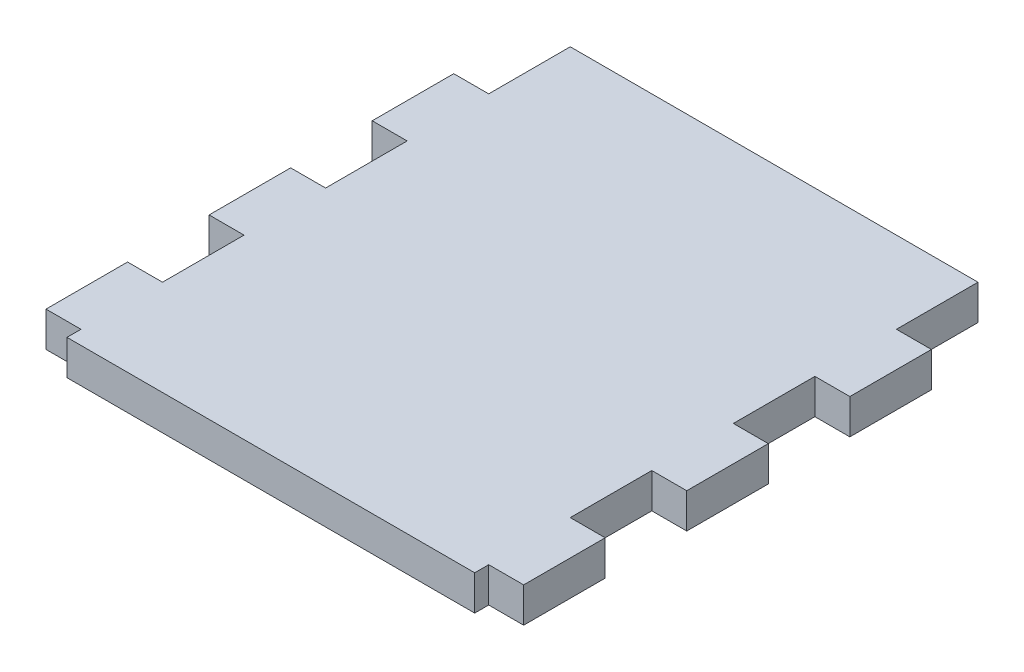
ISO-10303-21;
HEADER;
FILE_DESCRIPTION(('STEP AP214'),'2;1');
FILE_NAME('part.step','',(''),(''),'','','');
FILE_SCHEMA(('AUTOMOTIVE_DESIGN { 1 0 10303 214 1 1 1 1 }'));
ENDSEC;
DATA;
#1=APPLICATION_CONTEXT('core data for automotive mechanical design processes');
#2=APPLICATION_PROTOCOL_DEFINITION('international standard','automotive_design',2000,#1);
#3=PRODUCT_CONTEXT('',#1,'mechanical');
#4=PRODUCT('Part','Part','',(#3));
#5=PRODUCT_RELATED_PRODUCT_CATEGORY('part','',(#4));
#6=PRODUCT_DEFINITION_FORMATION('','',#4);
#7=PRODUCT_DEFINITION_CONTEXT('part definition',#1,'design');
#8=PRODUCT_DEFINITION('design','',#6,#7);
#9=PRODUCT_DEFINITION_SHAPE('','',#8);
#10=(LENGTH_UNIT() NAMED_UNIT(*) SI_UNIT(.MILLI.,.METRE.));
#11=(NAMED_UNIT(*) PLANE_ANGLE_UNIT() SI_UNIT($,.RADIAN.));
#12=(NAMED_UNIT(*) SI_UNIT($,.STERADIAN.) SOLID_ANGLE_UNIT());
#13=UNCERTAINTY_MEASURE_WITH_UNIT(LENGTH_MEASURE(1.E-05),#10,'distance_accuracy_value','');
#14=(GEOMETRIC_REPRESENTATION_CONTEXT(3) GLOBAL_UNCERTAINTY_ASSIGNED_CONTEXT((#13)) GLOBAL_UNIT_ASSIGNED_CONTEXT((#10,
#11,#12)) REPRESENTATION_CONTEXT('',''));
#15=CARTESIAN_POINT('',(0.,0.,0.));
#16=DIRECTION('',(0.,0.,1.));
#17=DIRECTION('',(1.,0.,0.));
#18=AXIS2_PLACEMENT_3D('',#15,#16,#17);
#19=CARTESIAN_POINT('',(0.,3.,-42.));
#20=DIRECTION('',(0.,0.,-1.));
#21=DIRECTION('',(-1.,0.,0.));
#22=AXIS2_PLACEMENT_3D('',#19,#20,#21);
#23=PLANE('',#22);
#24=DIRECTION('',(1.,0.,0.));
#25=VECTOR('',#24,1.);
#26=CARTESIAN_POINT('',(0.,0.,-42.));
#27=LINE('',#26,#25);
#28=CARTESIAN_POINT('',(0.,0.,-42.));
#29=VERTEX_POINT('',#28);
#30=CARTESIAN_POINT('',(35.,0.,-42.));
#31=VERTEX_POINT('',#30);
#32=EDGE_CURVE('E258',#29,#31,#27,.T.);
#33=ORIENTED_EDGE('',*,*,#32,.F.);
#34=DIRECTION('',(0.,-1.,0.));
#35=VECTOR('',#34,1.);
#36=CARTESIAN_POINT('',(0.,3.,-42.));
#37=LINE('',#36,#35);
#38=CARTESIAN_POINT('',(0.,3.,-42.));
#39=VERTEX_POINT('',#38);
#40=EDGE_CURVE('E11',#39,#29,#37,.T.);
#41=ORIENTED_EDGE('',*,*,#40,.F.);
#42=DIRECTION('',(1.,0.,0.));
#43=VECTOR('',#42,1.);
#44=CARTESIAN_POINT('',(0.,3.,-42.));
#45=LINE('',#44,#43);
#46=CARTESIAN_POINT('',(35.,3.,-42.));
#47=VERTEX_POINT('',#46);
#48=EDGE_CURVE('E444',#39,#47,#45,.T.);
#49=ORIENTED_EDGE('',*,*,#48,.T.);
#50=DIRECTION('',(0.,-1.,0.));
#51=VECTOR('',#50,1.);
#52=CARTESIAN_POINT('',(35.,3.,-42.));
#53=LINE('',#52,#51);
#54=EDGE_CURVE('E150',#47,#31,#53,.T.);
#55=ORIENTED_EDGE('',*,*,#54,.T.);
#56=EDGE_LOOP('',(#33,#41,#49,#55));
#57=FACE_BOUND('',#56,.T.);
#58=ADVANCED_FACE('F39',(#57),#23,.T.);
#59=CARTESIAN_POINT('',(0.,3.,0.));
#60=DIRECTION('',(-1.,0.,0.));
#61=DIRECTION('',(0.,0.,1.));
#62=AXIS2_PLACEMENT_3D('',#59,#60,#61);
#63=PLANE('',#62);
#64=DIRECTION('',(0.,0.,-1.));
#65=VECTOR('',#64,1.);
#66=CARTESIAN_POINT('',(0.,0.,0.));
#67=LINE('',#66,#65);
#68=CARTESIAN_POINT('',(0.,0.,-35.));
#69=VERTEX_POINT('',#68);
#70=EDGE_CURVE('E262',#69,#29,#67,.T.);
#71=ORIENTED_EDGE('',*,*,#70,.F.);
#72=DIRECTION('',(0.,-1.,0.));
#73=VECTOR('',#72,1.);
#74=CARTESIAN_POINT('',(0.,3.,-35.));
#75=LINE('',#74,#73);
#76=CARTESIAN_POINT('',(0.,3.,-35.));
#77=VERTEX_POINT('',#76);
#78=EDGE_CURVE('E48',#77,#69,#75,.T.);
#79=ORIENTED_EDGE('',*,*,#78,.F.);
#80=DIRECTION('',(0.,0.,-1.));
#81=VECTOR('',#80,1.);
#82=CARTESIAN_POINT('',(0.,3.,0.));
#83=LINE('',#82,#81);
#84=EDGE_CURVE('E442',#77,#39,#83,.T.);
#85=ORIENTED_EDGE('',*,*,#84,.T.);
#86=ORIENTED_EDGE('',*,*,#40,.T.);
#87=EDGE_LOOP('',(#71,#79,#85,#86));
#88=FACE_BOUND('',#87,.T.);
#89=ADVANCED_FACE('F441',(#88),#63,.T.);
#90=CARTESIAN_POINT('',(0.,3.,-35.));
#91=DIRECTION('',(0.,0.,1.));
#92=DIRECTION('',(1.,0.,0.));
#93=AXIS2_PLACEMENT_3D('',#90,#91,#92);
#94=PLANE('',#93);
#95=DIRECTION('',(-1.,0.,0.));
#96=VECTOR('',#95,1.);
#97=CARTESIAN_POINT('',(0.,0.,-35.));
#98=LINE('',#97,#96);
#99=CARTESIAN_POINT('',(-3.,0.,-35.));
#100=VERTEX_POINT('',#99);
#101=EDGE_CURVE('E266',#69,#100,#98,.T.);
#102=ORIENTED_EDGE('',*,*,#101,.T.);
#103=DIRECTION('',(0.,-1.,0.));
#104=VECTOR('',#103,1.);
#105=CARTESIAN_POINT('',(-3.,3.,-35.));
#106=LINE('',#105,#104);
#107=CARTESIAN_POINT('',(-3.,3.,-35.));
#108=VERTEX_POINT('',#107);
#109=EDGE_CURVE('E424',#108,#100,#106,.T.);
#110=ORIENTED_EDGE('',*,*,#109,.F.);
#111=DIRECTION('',(-1.,0.,0.));
#112=VECTOR('',#111,1.);
#113=CARTESIAN_POINT('',(0.,3.,-35.));
#114=LINE('',#113,#112);
#115=EDGE_CURVE('E433',#77,#108,#114,.T.);
#116=ORIENTED_EDGE('',*,*,#115,.F.);
#117=ORIENTED_EDGE('',*,*,#78,.T.);
#118=EDGE_LOOP('',(#102,#110,#116,#117));
#119=FACE_BOUND('',#118,.T.);
#120=ADVANCED_FACE('F431',(#119),#94,.F.);
#121=CARTESIAN_POINT('',(-3.00000000000004,3.,0.));
#122=DIRECTION('',(1.,0.,0.));
#123=DIRECTION('',(0.,0.,-1.));
#124=AXIS2_PLACEMENT_3D('',#121,#122,#123);
#125=PLANE('',#124);
#126=DIRECTION('',(0.,0.,1.));
#127=VECTOR('',#126,1.);
#128=CARTESIAN_POINT('',(-3.00000000000004,0.,0.));
#129=LINE('',#128,#127);
#130=CARTESIAN_POINT('',(-3.00000000000001,0.,-28.));
#131=VERTEX_POINT('',#130);
#132=EDGE_CURVE('E271',#100,#131,#129,.T.);
#133=ORIENTED_EDGE('',*,*,#132,.T.);
#134=DIRECTION('',(0.,-1.,0.));
#135=VECTOR('',#134,1.);
#136=CARTESIAN_POINT('',(-3.00000000000001,3.,-28.));
#137=LINE('',#136,#135);
#138=CARTESIAN_POINT('',(-3.00000000000001,3.,-28.));
#139=VERTEX_POINT('',#138);
#140=EDGE_CURVE('E421',#139,#131,#137,.T.);
#141=ORIENTED_EDGE('',*,*,#140,.F.);
#142=DIRECTION('',(0.,0.,1.));
#143=VECTOR('',#142,1.);
#144=CARTESIAN_POINT('',(-3.00000000000004,3.,0.));
#145=LINE('',#144,#143);
#146=EDGE_CURVE('E519',#108,#139,#145,.T.);
#147=ORIENTED_EDGE('',*,*,#146,.F.);
#148=ORIENTED_EDGE('',*,*,#109,.T.);
#149=EDGE_LOOP('',(#133,#141,#147,#148));
#150=FACE_BOUND('',#149,.T.);
#151=ADVANCED_FACE('F580',(#150),#125,.F.);
#152=CARTESIAN_POINT('',(0.,3.,-28.));
#153=DIRECTION('',(0.,0.,1.));
#154=DIRECTION('',(1.,0.,0.));
#155=AXIS2_PLACEMENT_3D('',#152,#153,#154);
#156=PLANE('',#155);
#157=DIRECTION('',(-1.,0.,0.));
#158=VECTOR('',#157,1.);
#159=CARTESIAN_POINT('',(0.,0.,-28.));
#160=LINE('',#159,#158);
#161=CARTESIAN_POINT('',(0.,0.,-28.));
#162=VERTEX_POINT('',#161);
#163=EDGE_CURVE('E275',#162,#131,#160,.T.);
#164=ORIENTED_EDGE('',*,*,#163,.F.);
#165=DIRECTION('',(0.,-1.,0.));
#166=VECTOR('',#165,1.);
#167=CARTESIAN_POINT('',(0.,3.,-28.));
#168=LINE('',#167,#166);
#169=CARTESIAN_POINT('',(0.,3.,-28.));
#170=VERTEX_POINT('',#169);
#171=EDGE_CURVE('E418',#170,#162,#168,.T.);
#172=ORIENTED_EDGE('',*,*,#171,.F.);
#173=DIRECTION('',(-1.,0.,0.));
#174=VECTOR('',#173,1.);
#175=CARTESIAN_POINT('',(0.,3.,-28.));
#176=LINE('',#175,#174);
#177=EDGE_CURVE('E515',#170,#139,#176,.T.);
#178=ORIENTED_EDGE('',*,*,#177,.T.);
#179=ORIENTED_EDGE('',*,*,#140,.T.);
#180=EDGE_LOOP('',(#164,#172,#178,#179));
#181=FACE_BOUND('',#180,.T.);
#182=ADVANCED_FACE('F540',(#181),#156,.T.);
#183=CARTESIAN_POINT('',(0.,0.,-21.));
#184=VERTEX_POINT('',#183);
#185=EDGE_CURVE('E268',#184,#162,#67,.T.);
#186=ORIENTED_EDGE('',*,*,#185,.F.);
#187=DIRECTION('',(0.,-1.,0.));
#188=VECTOR('',#187,1.);
#189=CARTESIAN_POINT('',(0.,3.,-21.));
#190=LINE('',#189,#188);
#191=CARTESIAN_POINT('',(0.,3.,-21.));
#192=VERTEX_POINT('',#191);
#193=EDGE_CURVE('E415',#192,#184,#190,.T.);
#194=ORIENTED_EDGE('',*,*,#193,.F.);
#195=EDGE_CURVE('E514',#192,#170,#83,.T.);
#196=ORIENTED_EDGE('',*,*,#195,.T.);
#197=ORIENTED_EDGE('',*,*,#171,.T.);
#198=EDGE_LOOP('',(#186,#194,#196,#197));
#199=FACE_BOUND('',#198,.T.);
#200=ADVANCED_FACE('F532',(#199),#63,.T.);
#201=CARTESIAN_POINT('',(0.,3.,-21.));
#202=DIRECTION('',(0.,0.,1.));
#203=DIRECTION('',(1.,0.,0.));
#204=AXIS2_PLACEMENT_3D('',#201,#202,#203);
#205=PLANE('',#204);
#206=DIRECTION('',(-1.,0.,0.));
#207=VECTOR('',#206,1.);
#208=CARTESIAN_POINT('',(0.,0.,-21.));
#209=LINE('',#208,#207);
#210=CARTESIAN_POINT('',(-3.00000000000014,0.,-21.));
#211=VERTEX_POINT('',#210);
#212=EDGE_CURVE('E279',#184,#211,#209,.T.);
#213=ORIENTED_EDGE('',*,*,#212,.T.);
#214=DIRECTION('',(0.,-1.,0.));
#215=VECTOR('',#214,1.);
#216=CARTESIAN_POINT('',(-3.00000000000014,3.,-21.));
#217=LINE('',#216,#215);
#218=CARTESIAN_POINT('',(-3.00000000000014,3.,-21.));
#219=VERTEX_POINT('',#218);
#220=EDGE_CURVE('E411',#219,#211,#217,.T.);
#221=ORIENTED_EDGE('',*,*,#220,.F.);
#222=DIRECTION('',(-1.,0.,0.));
#223=VECTOR('',#222,1.);
#224=CARTESIAN_POINT('',(0.,3.,-21.));
#225=LINE('',#224,#223);
#226=EDGE_CURVE('E511',#192,#219,#225,.T.);
#227=ORIENTED_EDGE('',*,*,#226,.F.);
#228=ORIENTED_EDGE('',*,*,#193,.T.);
#229=EDGE_LOOP('',(#213,#221,#227,#228));
#230=FACE_BOUND('',#229,.T.);
#231=ADVANCED_FACE('F563',(#230),#205,.F.);
#232=CARTESIAN_POINT('',(-3.00000000000018,3.,0.));
#233=DIRECTION('',(1.,0.,0.));
#234=DIRECTION('',(0.,0.,-1.));
#235=AXIS2_PLACEMENT_3D('',#232,#233,#234);
#236=PLANE('',#235);
#237=DIRECTION('',(0.,0.,1.));
#238=VECTOR('',#237,1.);
#239=CARTESIAN_POINT('',(-3.00000000000018,0.,0.));
#240=LINE('',#239,#238);
#241=CARTESIAN_POINT('',(-3.00000000000016,0.,-14.));
#242=VERTEX_POINT('',#241);
#243=EDGE_CURVE('E282',#211,#242,#240,.T.);
#244=ORIENTED_EDGE('',*,*,#243,.T.);
#245=DIRECTION('',(0.,-1.,0.));
#246=VECTOR('',#245,1.);
#247=CARTESIAN_POINT('',(-3.00000000000016,3.,-14.));
#248=LINE('',#247,#246);
#249=CARTESIAN_POINT('',(-3.00000000000016,3.,-14.));
#250=VERTEX_POINT('',#249);
#251=EDGE_CURVE('E408',#250,#242,#248,.T.);
#252=ORIENTED_EDGE('',*,*,#251,.F.);
#253=DIRECTION('',(0.,0.,1.));
#254=VECTOR('',#253,1.);
#255=CARTESIAN_POINT('',(-3.00000000000018,3.,0.));
#256=LINE('',#255,#254);
#257=EDGE_CURVE('E508',#219,#250,#256,.T.);
#258=ORIENTED_EDGE('',*,*,#257,.F.);
#259=ORIENTED_EDGE('',*,*,#220,.T.);
#260=EDGE_LOOP('',(#244,#252,#258,#259));
#261=FACE_BOUND('',#260,.T.);
#262=ADVANCED_FACE('F561',(#261),#236,.F.);
#263=CARTESIAN_POINT('',(0.,3.,-14.));
#264=DIRECTION('',(0.,0.,1.));
#265=DIRECTION('',(1.,0.,0.));
#266=AXIS2_PLACEMENT_3D('',#263,#264,#265);
#267=PLANE('',#266);
#268=DIRECTION('',(-1.,0.,0.));
#269=VECTOR('',#268,1.);
#270=CARTESIAN_POINT('',(0.,0.,-14.));
#271=LINE('',#270,#269);
#272=CARTESIAN_POINT('',(0.,0.,-14.));
#273=VERTEX_POINT('',#272);
#274=EDGE_CURVE('E286',#273,#242,#271,.T.);
#275=ORIENTED_EDGE('',*,*,#274,.F.);
#276=DIRECTION('',(0.,-1.,0.));
#277=VECTOR('',#276,1.);
#278=CARTESIAN_POINT('',(0.,3.,-14.));
#279=LINE('',#278,#277);
#280=CARTESIAN_POINT('',(0.,3.,-14.));
#281=VERTEX_POINT('',#280);
#282=EDGE_CURVE('E405',#281,#273,#279,.T.);
#283=ORIENTED_EDGE('',*,*,#282,.F.);
#284=DIRECTION('',(-1.,0.,0.));
#285=VECTOR('',#284,1.);
#286=CARTESIAN_POINT('',(0.,3.,-14.));
#287=LINE('',#286,#285);
#288=EDGE_CURVE('E504',#281,#250,#287,.T.);
#289=ORIENTED_EDGE('',*,*,#288,.T.);
#290=ORIENTED_EDGE('',*,*,#251,.T.);
#291=EDGE_LOOP('',(#275,#283,#289,#290));
#292=FACE_BOUND('',#291,.T.);
#293=ADVANCED_FACE('F557',(#292),#267,.T.);
#294=CARTESIAN_POINT('',(0.,0.,-7.00000000000003));
#295=VERTEX_POINT('',#294);
#296=EDGE_CURVE('E267',#295,#273,#67,.T.);
#297=ORIENTED_EDGE('',*,*,#296,.F.);
#298=DIRECTION('',(0.,-1.,0.));
#299=VECTOR('',#298,1.);
#300=CARTESIAN_POINT('',(0.,3.,-7.00000000000003));
#301=LINE('',#300,#299);
#302=CARTESIAN_POINT('',(0.,3.,-7.00000000000003));
#303=VERTEX_POINT('',#302);
#304=EDGE_CURVE('E402',#303,#295,#301,.T.);
#305=ORIENTED_EDGE('',*,*,#304,.F.);
#306=EDGE_CURVE('E503',#303,#281,#83,.T.);
#307=ORIENTED_EDGE('',*,*,#306,.T.);
#308=ORIENTED_EDGE('',*,*,#282,.T.);
#309=EDGE_LOOP('',(#297,#305,#307,#308));
#310=FACE_BOUND('',#309,.T.);
#311=ADVANCED_FACE('F552',(#310),#63,.T.);
#312=CARTESIAN_POINT('',(0.,3.,-7.00000000000003));
#313=DIRECTION('',(0.,0.,1.));
#314=DIRECTION('',(1.,0.,0.));
#315=AXIS2_PLACEMENT_3D('',#312,#313,#314);
#316=PLANE('',#315);
#317=DIRECTION('',(-1.,0.,0.));
#318=VECTOR('',#317,1.);
#319=CARTESIAN_POINT('',(0.,0.,-7.00000000000003));
#320=LINE('',#319,#318);
#321=CARTESIAN_POINT('',(-3.00000000000028,0.,-7.00000000000003));
#322=VERTEX_POINT('',#321);
#323=EDGE_CURVE('E290',#295,#322,#320,.T.);
#324=ORIENTED_EDGE('',*,*,#323,.T.);
#325=DIRECTION('',(0.,-1.,0.));
#326=VECTOR('',#325,1.);
#327=CARTESIAN_POINT('',(-3.00000000000028,3.,-7.00000000000003));
#328=LINE('',#327,#326);
#329=CARTESIAN_POINT('',(-3.00000000000028,3.,-7.00000000000003));
#330=VERTEX_POINT('',#329);
#331=EDGE_CURVE('E398',#330,#322,#328,.T.);
#332=ORIENTED_EDGE('',*,*,#331,.F.);
#333=DIRECTION('',(-1.,0.,0.));
#334=VECTOR('',#333,1.);
#335=CARTESIAN_POINT('',(0.,3.,-7.00000000000003));
#336=LINE('',#335,#334);
#337=EDGE_CURVE('E500',#303,#330,#336,.T.);
#338=ORIENTED_EDGE('',*,*,#337,.F.);
#339=ORIENTED_EDGE('',*,*,#304,.T.);
#340=EDGE_LOOP('',(#324,#332,#338,#339));
#341=FACE_BOUND('',#340,.T.);
#342=ADVANCED_FACE('F584',(#341),#316,.F.);
#343=CARTESIAN_POINT('',(-3.00000000000029,3.,0.));
#344=DIRECTION('',(1.,0.,0.));
#345=DIRECTION('',(0.,0.,-1.));
#346=AXIS2_PLACEMENT_3D('',#343,#344,#345);
#347=PLANE('',#346);
#348=DIRECTION('',(0.,0.,1.));
#349=VECTOR('',#348,1.);
#350=CARTESIAN_POINT('',(-3.00000000000029,0.,0.));
#351=LINE('',#350,#349);
#352=CARTESIAN_POINT('',(-3.00000000000029,0.,0.));
#353=VERTEX_POINT('',#352);
#354=EDGE_CURVE('E293',#322,#353,#351,.T.);
#355=ORIENTED_EDGE('',*,*,#354,.T.);
#356=DIRECTION('',(0.,-1.,0.));
#357=VECTOR('',#356,1.);
#358=CARTESIAN_POINT('',(-3.00000000000029,3.,0.));
#359=LINE('',#358,#357);
#360=CARTESIAN_POINT('',(-3.00000000000029,3.,0.));
#361=VERTEX_POINT('',#360);
#362=EDGE_CURVE('E395',#361,#353,#359,.T.);
#363=ORIENTED_EDGE('',*,*,#362,.F.);
#364=DIRECTION('',(0.,0.,1.));
#365=VECTOR('',#364,1.);
#366=CARTESIAN_POINT('',(-3.00000000000029,3.,0.));
#367=LINE('',#366,#365);
#368=EDGE_CURVE('E497',#330,#361,#367,.T.);
#369=ORIENTED_EDGE('',*,*,#368,.F.);
#370=ORIENTED_EDGE('',*,*,#331,.T.);
#371=EDGE_LOOP('',(#355,#363,#369,#370));
#372=FACE_BOUND('',#371,.T.);
#373=ADVANCED_FACE('F589',(#372),#347,.F.);
#374=CARTESIAN_POINT('',(0.,3.,0.));
#375=DIRECTION('',(0.,0.,1.));
#376=DIRECTION('',(1.,0.,0.));
#377=AXIS2_PLACEMENT_3D('',#374,#375,#376);
#378=PLANE('',#377);
#379=DIRECTION('',(-1.,0.,0.));
#380=VECTOR('',#379,1.);
#381=CARTESIAN_POINT('',(0.,0.,0.));
#382=LINE('',#381,#380);
#383=CARTESIAN_POINT('',(0.,0.,0.));
#384=VERTEX_POINT('',#383);
#385=EDGE_CURVE('E297',#384,#353,#382,.T.);
#386=ORIENTED_EDGE('',*,*,#385,.F.);
#387=DIRECTION('',(0.,-1.,0.));
#388=VECTOR('',#387,1.);
#389=CARTESIAN_POINT('',(0.,3.,0.));
#390=LINE('',#389,#388);
#391=CARTESIAN_POINT('',(0.,3.,0.));
#392=VERTEX_POINT('',#391);
#393=EDGE_CURVE('E392',#392,#384,#390,.T.);
#394=ORIENTED_EDGE('',*,*,#393,.F.);
#395=DIRECTION('',(-1.,0.,0.));
#396=VECTOR('',#395,1.);
#397=CARTESIAN_POINT('',(0.,3.,0.));
#398=LINE('',#397,#396);
#399=EDGE_CURVE('E493',#392,#361,#398,.T.);
#400=ORIENTED_EDGE('',*,*,#399,.T.);
#401=ORIENTED_EDGE('',*,*,#362,.T.);
#402=EDGE_LOOP('',(#386,#394,#400,#401));
#403=FACE_BOUND('',#402,.T.);
#404=ADVANCED_FACE('F685',(#403),#378,.T.);
#405=CARTESIAN_POINT('',(0.,3.,0.));
#406=DIRECTION('',(1.,0.,0.));
#407=DIRECTION('',(0.,0.,-1.));
#408=AXIS2_PLACEMENT_3D('',#405,#406,#407);
#409=PLANE('',#408);
#410=DIRECTION('',(0.,0.,1.));
#411=VECTOR('',#410,1.);
#412=CARTESIAN_POINT('',(0.,0.,0.));
#413=LINE('',#412,#411);
#414=CARTESIAN_POINT('',(0.,0.,1.2));
#415=VERTEX_POINT('',#414);
#416=EDGE_CURVE('E301',#384,#415,#413,.T.);
#417=ORIENTED_EDGE('',*,*,#416,.T.);
#418=DIRECTION('',(0.,-1.,0.));
#419=VECTOR('',#418,1.);
#420=CARTESIAN_POINT('',(0.,3.,1.2));
#421=LINE('',#420,#419);
#422=CARTESIAN_POINT('',(0.,3.,1.2));
#423=VERTEX_POINT('',#422);
#424=EDGE_CURVE('E388',#423,#415,#421,.T.);
#425=ORIENTED_EDGE('',*,*,#424,.F.);
#426=DIRECTION('',(0.,0.,1.));
#427=VECTOR('',#426,1.);
#428=CARTESIAN_POINT('',(0.,3.,0.));
#429=LINE('',#428,#427);
#430=EDGE_CURVE('E490',#392,#423,#429,.T.);
#431=ORIENTED_EDGE('',*,*,#430,.F.);
#432=ORIENTED_EDGE('',*,*,#393,.T.);
#433=EDGE_LOOP('',(#417,#425,#431,#432));
#434=FACE_BOUND('',#433,.T.);
#435=ADVANCED_FACE('F694',(#434),#409,.F.);
#436=CARTESIAN_POINT('',(0.,3.,1.2));
#437=DIRECTION('',(0.,0.,-1.));
#438=DIRECTION('',(-1.,0.,0.));
#439=AXIS2_PLACEMENT_3D('',#436,#437,#438);
#440=PLANE('',#439);
#441=DIRECTION('',(1.,0.,0.));
#442=VECTOR('',#441,1.);
#443=CARTESIAN_POINT('',(0.,0.,1.2));
#444=LINE('',#443,#442);
#445=CARTESIAN_POINT('',(35.0000000000007,0.,1.19999999999963));
#446=VERTEX_POINT('',#445);
#447=EDGE_CURVE('E304',#415,#446,#444,.T.);
#448=ORIENTED_EDGE('',*,*,#447,.T.);
#449=DIRECTION('',(0.,-1.,0.));
#450=VECTOR('',#449,1.);
#451=CARTESIAN_POINT('',(35.0000000000007,3.,1.19999999999963));
#452=LINE('',#451,#450);
#453=CARTESIAN_POINT('',(35.0000000000007,3.,1.19999999999963));
#454=VERTEX_POINT('',#453);
#455=EDGE_CURVE('E385',#454,#446,#452,.T.);
#456=ORIENTED_EDGE('',*,*,#455,.F.);
#457=DIRECTION('',(1.,0.,0.));
#458=VECTOR('',#457,1.);
#459=CARTESIAN_POINT('',(0.,3.,1.2));
#460=LINE('',#459,#458);
#461=EDGE_CURVE('E487',#423,#454,#460,.T.);
#462=ORIENTED_EDGE('',*,*,#461,.F.);
#463=ORIENTED_EDGE('',*,*,#424,.T.);
#464=EDGE_LOOP('',(#448,#456,#462,#463));
#465=FACE_BOUND('',#464,.T.);
#466=ADVANCED_FACE('F703',(#465),#440,.F.);
#467=CARTESIAN_POINT('',(35.0000000000009,3.,6.47630097698024E-12));
#468=DIRECTION('',(1.,0.,1.85037170770859E-13));
#469=DIRECTION('',(1.85037170770859E-13,0.,-1.));
#470=AXIS2_PLACEMENT_3D('',#467,#468,#469);
#471=PLANE('',#470);
#472=DIRECTION('',(-1.85037170770859E-13,0.,1.));
#473=VECTOR('',#472,1.);
#474=CARTESIAN_POINT('',(35.0000000000009,0.,6.47630097698024E-12));
#475=LINE('',#474,#473);
#476=CARTESIAN_POINT('',(35.0000000000009,0.,-3.66605540578528E-13));
#477=VERTEX_POINT('',#476);
#478=EDGE_CURVE('E308',#477,#446,#475,.T.);
#479=ORIENTED_EDGE('',*,*,#478,.F.);
#480=DIRECTION('',(0.,-1.,0.));
#481=VECTOR('',#480,1.);
#482=CARTESIAN_POINT('',(35.0000000000009,3.,-3.66605540578528E-13));
#483=LINE('',#482,#481);
#484=CARTESIAN_POINT('',(35.0000000000009,3.,-3.66605540578528E-13));
#485=VERTEX_POINT('',#484);
#486=EDGE_CURVE('E382',#485,#477,#483,.T.);
#487=ORIENTED_EDGE('',*,*,#486,.F.);
#488=DIRECTION('',(-1.85037170770859E-13,0.,1.));
#489=VECTOR('',#488,1.);
#490=CARTESIAN_POINT('',(35.0000000000009,3.,6.47630097698024E-12));
#491=LINE('',#490,#489);
#492=EDGE_CURVE('E483',#485,#454,#491,.T.);
#493=ORIENTED_EDGE('',*,*,#492,.T.);
#494=ORIENTED_EDGE('',*,*,#455,.T.);
#495=EDGE_LOOP('',(#479,#487,#493,#494));
#496=FACE_BOUND('',#495,.T.);
#497=ADVANCED_FACE('F712',(#496),#471,.T.);
#498=CARTESIAN_POINT('',(0.,3.,0.));
#499=DIRECTION('',(0.,0.,-1.));
#500=DIRECTION('',(-1.,0.,0.));
#501=AXIS2_PLACEMENT_3D('',#498,#499,#500);
#502=PLANE('',#501);
#503=DIRECTION('',(1.,0.,0.));
#504=VECTOR('',#503,1.);
#505=CARTESIAN_POINT('',(0.,0.,0.));
#506=LINE('',#505,#504);
#507=CARTESIAN_POINT('',(38.0000000000009,0.,-4.0245584548128E-13));
#508=VERTEX_POINT('',#507);
#509=EDGE_CURVE('E312',#477,#508,#506,.T.);
#510=ORIENTED_EDGE('',*,*,#509,.T.);
#511=DIRECTION('',(0.,-1.,0.));
#512=VECTOR('',#511,1.);
#513=CARTESIAN_POINT('',(38.0000000000009,3.,-4.0245584548128E-13));
#514=LINE('',#513,#512);
#515=CARTESIAN_POINT('',(38.0000000000009,3.,-4.0245584548128E-13));
#516=VERTEX_POINT('',#515);
#517=EDGE_CURVE('E379',#516,#508,#514,.T.);
#518=ORIENTED_EDGE('',*,*,#517,.F.);
#519=DIRECTION('',(1.,0.,0.));
#520=VECTOR('',#519,1.);
#521=CARTESIAN_POINT('',(0.,3.,0.));
#522=LINE('',#521,#520);
#523=EDGE_CURVE('E480',#485,#516,#522,.T.);
#524=ORIENTED_EDGE('',*,*,#523,.F.);
#525=ORIENTED_EDGE('',*,*,#486,.T.);
#526=EDGE_LOOP('',(#510,#518,#524,#525));
#527=FACE_BOUND('',#526,.T.);
#528=ADVANCED_FACE('F721',(#527),#502,.F.);
#529=CARTESIAN_POINT('',(38.0000000000009,3.,-4.14351093119041E-13));
#530=DIRECTION('',(1.,0.,0.));
#531=DIRECTION('',(0.,0.,-1.));
#532=AXIS2_PLACEMENT_3D('',#529,#530,#531);
#533=PLANE('',#532);
#534=DIRECTION('',(0.,0.,1.));
#535=VECTOR('',#534,1.);
#536=CARTESIAN_POINT('',(38.0000000000009,0.,-4.14351093119041E-13));
#537=LINE('',#536,#535);
#538=CARTESIAN_POINT('',(38.0000000000008,0.,-7.0000000000004));
#539=VERTEX_POINT('',#538);
#540=EDGE_CURVE('E316',#539,#508,#537,.T.);
#541=ORIENTED_EDGE('',*,*,#540,.F.);
#542=DIRECTION('',(0.,-1.,0.));
#543=VECTOR('',#542,1.);
#544=CARTESIAN_POINT('',(38.0000000000008,3.,-7.0000000000004));
#545=LINE('',#544,#543);
#546=CARTESIAN_POINT('',(38.0000000000008,3.,-7.0000000000004));
#547=VERTEX_POINT('',#546);
#548=EDGE_CURVE('E376',#547,#539,#545,.T.);
#549=ORIENTED_EDGE('',*,*,#548,.F.);
#550=DIRECTION('',(0.,0.,1.));
#551=VECTOR('',#550,1.);
#552=CARTESIAN_POINT('',(38.0000000000009,3.,-4.14351093119041E-13));
#553=LINE('',#552,#551);
#554=EDGE_CURVE('E476',#547,#516,#553,.T.);
#555=ORIENTED_EDGE('',*,*,#554,.T.);
#556=ORIENTED_EDGE('',*,*,#517,.T.);
#557=EDGE_LOOP('',(#541,#549,#555,#556));
#558=FACE_BOUND('',#557,.T.);
#559=ADVANCED_FACE('F730',(#558),#533,.T.);
#560=CARTESIAN_POINT('',(0.,3.,-6.99999999999996));
#561=DIRECTION('',(0.,0.,-1.));
#562=DIRECTION('',(-1.,0.,0.));
#563=AXIS2_PLACEMENT_3D('',#560,#561,#562);
#564=PLANE('',#563);
#565=DIRECTION('',(1.,0.,0.));
#566=VECTOR('',#565,1.);
#567=CARTESIAN_POINT('',(0.,0.,-6.99999999999996));
#568=LINE('',#567,#566);
#569=CARTESIAN_POINT('',(35.0000000000007,0.,-7.00000000000037));
#570=VERTEX_POINT('',#569);
#571=EDGE_CURVE('E320',#570,#539,#568,.T.);
#572=ORIENTED_EDGE('',*,*,#571,.F.);
#573=DIRECTION('',(0.,-1.,0.));
#574=VECTOR('',#573,1.);
#575=CARTESIAN_POINT('',(35.0000000000007,3.,-7.00000000000037));
#576=LINE('',#575,#574);
#577=CARTESIAN_POINT('',(35.0000000000007,3.,-7.00000000000037));
#578=VERTEX_POINT('',#577);
#579=EDGE_CURVE('E373',#578,#570,#576,.T.);
#580=ORIENTED_EDGE('',*,*,#579,.F.);
#581=DIRECTION('',(1.,0.,0.));
#582=VECTOR('',#581,1.);
#583=CARTESIAN_POINT('',(0.,3.,-6.99999999999996));
#584=LINE('',#583,#582);
#585=EDGE_CURVE('E472',#578,#547,#584,.T.);
#586=ORIENTED_EDGE('',*,*,#585,.T.);
#587=ORIENTED_EDGE('',*,*,#548,.T.);
#588=EDGE_LOOP('',(#572,#580,#586,#587));
#589=FACE_BOUND('',#588,.T.);
#590=ADVANCED_FACE('F739',(#589),#564,.T.);
#591=CARTESIAN_POINT('',(35.0000000000009,3.,-7.40148683083463E-13));
#592=DIRECTION('',(-1.,0.,0.));
#593=DIRECTION('',(0.,0.,1.));
#594=AXIS2_PLACEMENT_3D('',#591,#592,#593);
#595=PLANE('',#594);
#596=DIRECTION('',(0.,0.,-1.));
#597=VECTOR('',#596,1.);
#598=CARTESIAN_POINT('',(35.0000000000009,0.,-7.40148683083463E-13));
#599=LINE('',#598,#597);
#600=CARTESIAN_POINT('',(35.0000000000006,0.,-14.0000000000004));
#601=VERTEX_POINT('',#600);
#602=EDGE_CURVE('E324',#570,#601,#599,.T.);
#603=ORIENTED_EDGE('',*,*,#602,.T.);
#604=DIRECTION('',(0.,-1.,0.));
#605=VECTOR('',#604,1.);
#606=CARTESIAN_POINT('',(35.0000000000006,3.,-14.0000000000004));
#607=LINE('',#606,#605);
#608=CARTESIAN_POINT('',(35.0000000000006,3.,-14.0000000000004));
#609=VERTEX_POINT('',#608);
#610=EDGE_CURVE('E369',#609,#601,#607,.T.);
#611=ORIENTED_EDGE('',*,*,#610,.F.);
#612=DIRECTION('',(0.,0.,-1.));
#613=VECTOR('',#612,1.);
#614=CARTESIAN_POINT('',(35.0000000000009,3.,-7.40148683083463E-13));
#615=LINE('',#614,#613);
#616=EDGE_CURVE('E255',#578,#609,#615,.T.);
#617=ORIENTED_EDGE('',*,*,#616,.F.);
#618=ORIENTED_EDGE('',*,*,#579,.T.);
#619=EDGE_LOOP('',(#603,#611,#617,#618));
#620=FACE_BOUND('',#619,.T.);
#621=ADVANCED_FACE('F748',(#620),#595,.F.);
#622=CARTESIAN_POINT('',(-1.78098276866951E-13,3.,-13.9999999999999));
#623=DIRECTION('',(0.,0.,-1.));
#624=DIRECTION('',(-1.,0.,0.));
#625=AXIS2_PLACEMENT_3D('',#622,#623,#624);
#626=PLANE('',#625);
#627=DIRECTION('',(1.,0.,0.));
#628=VECTOR('',#627,1.);
#629=CARTESIAN_POINT('',(-1.78098276866951E-13,0.,-13.9999999999999));
#630=LINE('',#629,#628);
#631=CARTESIAN_POINT('',(38.0000000000007,0.,-14.0000000000004));
#632=VERTEX_POINT('',#631);
#633=EDGE_CURVE('E327',#601,#632,#630,.T.);
#634=ORIENTED_EDGE('',*,*,#633,.T.);
#635=DIRECTION('',(0.,-1.,0.));
#636=VECTOR('',#635,1.);
#637=CARTESIAN_POINT('',(38.0000000000007,3.,-14.0000000000004));
#638=LINE('',#637,#636);
#639=CARTESIAN_POINT('',(38.0000000000007,3.,-14.0000000000004));
#640=VERTEX_POINT('',#639);
#641=EDGE_CURVE('E366',#640,#632,#638,.T.);
#642=ORIENTED_EDGE('',*,*,#641,.F.);
#643=DIRECTION('',(1.,0.,0.));
#644=VECTOR('',#643,1.);
#645=CARTESIAN_POINT('',(-1.78098276866951E-13,3.,-13.9999999999999));
#646=LINE('',#645,#644);
#647=EDGE_CURVE('E468',#609,#640,#646,.T.);
#648=ORIENTED_EDGE('',*,*,#647,.F.);
#649=ORIENTED_EDGE('',*,*,#610,.T.);
#650=EDGE_LOOP('',(#634,#642,#648,#649));
#651=FACE_BOUND('',#650,.T.);
#652=ADVANCED_FACE('F757',(#651),#626,.F.);
#653=CARTESIAN_POINT('',(38.0000000000009,3.,-4.14351093119042E-13));
#654=DIRECTION('',(1.,0.,0.));
#655=DIRECTION('',(0.,0.,-1.));
#656=AXIS2_PLACEMENT_3D('',#653,#654,#655);
#657=PLANE('',#656);
#658=DIRECTION('',(0.,0.,1.));
#659=VECTOR('',#658,1.);
#660=CARTESIAN_POINT('',(38.0000000000009,0.,-4.14351093119042E-13));
#661=LINE('',#660,#659);
#662=CARTESIAN_POINT('',(38.0000000000007,0.,-21.0000000000004));
#663=VERTEX_POINT('',#662);
#664=EDGE_CURVE('E333',#663,#632,#661,.T.);
#665=ORIENTED_EDGE('',*,*,#664,.F.);
#666=DIRECTION('',(0.,-1.,0.));
#667=VECTOR('',#666,1.);
#668=CARTESIAN_POINT('',(38.0000000000007,3.,-21.0000000000004));
#669=LINE('',#668,#667);
#670=CARTESIAN_POINT('',(38.0000000000007,3.,-21.0000000000004));
#671=VERTEX_POINT('',#670);
#672=EDGE_CURVE('E363',#671,#663,#669,.T.);
#673=ORIENTED_EDGE('',*,*,#672,.F.);
#674=DIRECTION('',(0.,0.,1.));
#675=VECTOR('',#674,1.);
#676=CARTESIAN_POINT('',(38.0000000000009,3.,-4.14351093119042E-13));
#677=LINE('',#676,#675);
#678=EDGE_CURVE('E464',#671,#640,#677,.T.);
#679=ORIENTED_EDGE('',*,*,#678,.T.);
#680=ORIENTED_EDGE('',*,*,#641,.T.);
#681=EDGE_LOOP('',(#665,#673,#679,#680));
#682=FACE_BOUND('',#681,.T.);
#683=ADVANCED_FACE('F776',(#682),#657,.T.);
#684=CARTESIAN_POINT('',(-2.42861286636764E-13,3.,-21.));
#685=DIRECTION('',(0.,0.,-1.));
#686=DIRECTION('',(-1.,0.,0.));
#687=AXIS2_PLACEMENT_3D('',#684,#685,#686);
#688=PLANE('',#687);
#689=DIRECTION('',(1.,0.,0.));
#690=VECTOR('',#689,1.);
#691=CARTESIAN_POINT('',(-2.42861286636764E-13,0.,-21.));
#692=LINE('',#691,#690);
#693=CARTESIAN_POINT('',(35.0000000000004,0.,-21.0000000000004));
#694=VERTEX_POINT('',#693);
#695=EDGE_CURVE('E337',#694,#663,#692,.T.);
#696=ORIENTED_EDGE('',*,*,#695,.F.);
#697=DIRECTION('',(0.,-1.,0.));
#698=VECTOR('',#697,1.);
#699=CARTESIAN_POINT('',(35.0000000000004,3.,-21.0000000000004));
#700=LINE('',#699,#698);
#701=CARTESIAN_POINT('',(35.0000000000004,3.,-21.0000000000004));
#702=VERTEX_POINT('',#701);
#703=EDGE_CURVE('E360',#702,#694,#700,.T.);
#704=ORIENTED_EDGE('',*,*,#703,.F.);
#705=DIRECTION('',(1.,0.,0.));
#706=VECTOR('',#705,1.);
#707=CARTESIAN_POINT('',(-2.42861286636764E-13,3.,-21.));
#708=LINE('',#707,#706);
#709=EDGE_CURVE('E459',#702,#671,#708,.T.);
#710=ORIENTED_EDGE('',*,*,#709,.T.);
#711=ORIENTED_EDGE('',*,*,#672,.T.);
#712=EDGE_LOOP('',(#696,#704,#710,#711));
#713=FACE_BOUND('',#712,.T.);
#714=ADVANCED_FACE('F785',(#713),#688,.T.);
#715=CARTESIAN_POINT('',(35.0000000000003,0.,-28.0000000000004));
#716=VERTEX_POINT('',#715);
#717=EDGE_CURVE('E329',#694,#716,#599,.T.);
#718=ORIENTED_EDGE('',*,*,#717,.T.);
#719=DIRECTION('',(0.,-1.,0.));
#720=VECTOR('',#719,1.);
#721=CARTESIAN_POINT('',(35.0000000000003,3.,-28.0000000000004));
#722=LINE('',#721,#720);
#723=CARTESIAN_POINT('',(35.0000000000003,3.,-28.0000000000004));
#724=VERTEX_POINT('',#723);
#725=EDGE_CURVE('E356',#724,#716,#722,.T.);
#726=ORIENTED_EDGE('',*,*,#725,.F.);
#727=EDGE_CURVE('E254',#702,#724,#615,.T.);
#728=ORIENTED_EDGE('',*,*,#727,.F.);
#729=ORIENTED_EDGE('',*,*,#703,.T.);
#730=EDGE_LOOP('',(#718,#726,#728,#729));
#731=FACE_BOUND('',#730,.T.);
#732=ADVANCED_FACE('F451',(#731),#595,.F.);
#733=CARTESIAN_POINT('',(-2.59052039079203E-13,3.,-28.));
#734=DIRECTION('',(0.,0.,-1.));
#735=DIRECTION('',(-1.,0.,0.));
#736=AXIS2_PLACEMENT_3D('',#733,#734,#735);
#737=PLANE('',#736);
#738=DIRECTION('',(1.,0.,0.));
#739=VECTOR('',#738,1.);
#740=CARTESIAN_POINT('',(-2.59052039079203E-13,0.,-28.));
#741=LINE('',#740,#739);
#742=CARTESIAN_POINT('',(38.0000000000006,0.,-28.0000000000004));
#743=VERTEX_POINT('',#742);
#744=EDGE_CURVE('E341',#716,#743,#741,.T.);
#745=ORIENTED_EDGE('',*,*,#744,.T.);
#746=DIRECTION('',(0.,-1.,0.));
#747=VECTOR('',#746,1.);
#748=CARTESIAN_POINT('',(38.0000000000006,3.,-28.0000000000004));
#749=LINE('',#748,#747);
#750=CARTESIAN_POINT('',(38.0000000000006,3.,-28.0000000000004));
#751=VERTEX_POINT('',#750);
#752=EDGE_CURVE('E240',#751,#743,#749,.T.);
#753=ORIENTED_EDGE('',*,*,#752,.F.);
#754=DIRECTION('',(1.,0.,0.));
#755=VECTOR('',#754,1.);
#756=CARTESIAN_POINT('',(-2.59052039079203E-13,3.,-28.));
#757=LINE('',#756,#755);
#758=EDGE_CURVE('E245',#724,#751,#757,.T.);
#759=ORIENTED_EDGE('',*,*,#758,.F.);
#760=ORIENTED_EDGE('',*,*,#725,.T.);
#761=EDGE_LOOP('',(#745,#753,#759,#760));
#762=FACE_BOUND('',#761,.T.);
#763=ADVANCED_FACE('F456',(#762),#737,.F.);
#764=CARTESIAN_POINT('',(38.0000000000009,3.,-4.14351093119041E-13));
#765=DIRECTION('',(1.,0.,0.));
#766=DIRECTION('',(0.,0.,-1.));
#767=AXIS2_PLACEMENT_3D('',#764,#765,#766);
#768=PLANE('',#767);
#769=DIRECTION('',(0.,0.,1.));
#770=VECTOR('',#769,1.);
#771=CARTESIAN_POINT('',(38.0000000000009,0.,-4.14351093119041E-13));
#772=LINE('',#771,#770);
#773=CARTESIAN_POINT('',(38.0000000000005,0.,-35.0000000000004));
#774=VERTEX_POINT('',#773);
#775=EDGE_CURVE('E234',#774,#743,#772,.T.);
#776=ORIENTED_EDGE('',*,*,#775,.F.);
#777=DIRECTION('',(0.,-1.,0.));
#778=VECTOR('',#777,1.);
#779=CARTESIAN_POINT('',(38.0000000000005,3.,-35.0000000000004));
#780=LINE('',#779,#778);
#781=CARTESIAN_POINT('',(38.0000000000005,3.,-35.0000000000004));
#782=VERTEX_POINT('',#781);
#783=EDGE_CURVE('E229',#782,#774,#780,.T.);
#784=ORIENTED_EDGE('',*,*,#783,.F.);
#785=DIRECTION('',(0.,0.,1.));
#786=VECTOR('',#785,1.);
#787=CARTESIAN_POINT('',(38.0000000000009,3.,-4.14351093119041E-13));
#788=LINE('',#787,#786);
#789=EDGE_CURVE('E232',#782,#751,#788,.T.);
#790=ORIENTED_EDGE('',*,*,#789,.T.);
#791=ORIENTED_EDGE('',*,*,#752,.T.);
#792=EDGE_LOOP('',(#776,#784,#790,#791));
#793=FACE_BOUND('',#792,.T.);
#794=ADVANCED_FACE('F231',(#793),#768,.T.);
#795=CARTESIAN_POINT('',(-4.04768811061274E-13,3.,-35.));
#796=DIRECTION('',(0.,0.,-1.));
#797=DIRECTION('',(-1.,0.,0.));
#798=AXIS2_PLACEMENT_3D('',#795,#796,#797);
#799=PLANE('',#798);
#800=DIRECTION('',(1.,0.,0.));
#801=VECTOR('',#800,1.);
#802=CARTESIAN_POINT('',(-4.04768811061274E-13,0.,-35.));
#803=LINE('',#802,#801);
#804=CARTESIAN_POINT('',(35.0000000000001,0.,-35.0000000000004));
#805=VERTEX_POINT('',#804);
#806=EDGE_CURVE('E347',#805,#774,#803,.T.);
#807=ORIENTED_EDGE('',*,*,#806,.F.);
#808=DIRECTION('',(0.,-1.,0.));
#809=VECTOR('',#808,1.);
#810=CARTESIAN_POINT('',(35.0000000000001,3.,-35.0000000000004));
#811=LINE('',#810,#809);
#812=CARTESIAN_POINT('',(35.0000000000001,3.,-35.0000000000004));
#813=VERTEX_POINT('',#812);
#814=EDGE_CURVE('E143',#813,#805,#811,.T.);
#815=ORIENTED_EDGE('',*,*,#814,.F.);
#816=DIRECTION('',(1.,0.,0.));
#817=VECTOR('',#816,1.);
#818=CARTESIAN_POINT('',(-4.04768811061274E-13,3.,-35.));
#819=LINE('',#818,#817);
#820=EDGE_CURVE('E243',#813,#782,#819,.T.);
#821=ORIENTED_EDGE('',*,*,#820,.T.);
#822=ORIENTED_EDGE('',*,*,#783,.T.);
#823=EDGE_LOOP('',(#807,#815,#821,#822));
#824=FACE_BOUND('',#823,.T.);
#825=ADVANCED_FACE('F249',(#824),#799,.T.);
#826=EDGE_CURVE('E328',#805,#31,#599,.T.);
#827=ORIENTED_EDGE('',*,*,#826,.T.);
#828=ORIENTED_EDGE('',*,*,#54,.F.);
#829=EDGE_CURVE('E56',#813,#47,#615,.T.);
#830=ORIENTED_EDGE('',*,*,#829,.F.);
#831=ORIENTED_EDGE('',*,*,#814,.T.);
#832=EDGE_LOOP('',(#827,#828,#830,#831));
#833=FACE_BOUND('',#832,.T.);
#834=ADVANCED_FACE('F760',(#833),#595,.F.);
#835=CARTESIAN_POINT('',(0.,3.,0.));
#836=DIRECTION('',(0.,1.,0.));
#837=DIRECTION('',(0.,0.,1.));
#838=AXIS2_PLACEMENT_3D('',#835,#836,#837);
#839=PLANE('',#838);
#840=ORIENTED_EDGE('',*,*,#48,.F.);
#841=ORIENTED_EDGE('',*,*,#84,.F.);
#842=ORIENTED_EDGE('',*,*,#115,.T.);
#843=ORIENTED_EDGE('',*,*,#146,.T.);
#844=ORIENTED_EDGE('',*,*,#177,.F.);
#845=ORIENTED_EDGE('',*,*,#195,.F.);
#846=ORIENTED_EDGE('',*,*,#226,.T.);
#847=ORIENTED_EDGE('',*,*,#257,.T.);
#848=ORIENTED_EDGE('',*,*,#288,.F.);
#849=ORIENTED_EDGE('',*,*,#306,.F.);
#850=ORIENTED_EDGE('',*,*,#337,.T.);
#851=ORIENTED_EDGE('',*,*,#368,.T.);
#852=ORIENTED_EDGE('',*,*,#399,.F.);
#853=ORIENTED_EDGE('',*,*,#430,.T.);
#854=ORIENTED_EDGE('',*,*,#461,.T.);
#855=ORIENTED_EDGE('',*,*,#492,.F.);
#856=ORIENTED_EDGE('',*,*,#523,.T.);
#857=ORIENTED_EDGE('',*,*,#554,.F.);
#858=ORIENTED_EDGE('',*,*,#585,.F.);
#859=ORIENTED_EDGE('',*,*,#616,.T.);
#860=ORIENTED_EDGE('',*,*,#647,.T.);
#861=ORIENTED_EDGE('',*,*,#678,.F.);
#862=ORIENTED_EDGE('',*,*,#709,.F.);
#863=ORIENTED_EDGE('',*,*,#727,.T.);
#864=ORIENTED_EDGE('',*,*,#758,.T.);
#865=ORIENTED_EDGE('',*,*,#789,.F.);
#866=ORIENTED_EDGE('',*,*,#820,.F.);
#867=ORIENTED_EDGE('',*,*,#829,.T.);
#868=EDGE_LOOP('',(#840,#841,#842,#843,#844,#845,#846,#847,#848,#849,#850,#851,#852,#853,#854,
#855,#856,#857,#858,#859,#860,#861,#862,#863,#864,#865,#866,#867));
#869=FACE_BOUND('',#868,.T.);
#870=ADVANCED_FACE('F242',(#869),#839,.T.);
#871=CARTESIAN_POINT('',(0.,0.,0.));
#872=DIRECTION('',(0.,1.,0.));
#873=DIRECTION('',(0.,0.,1.));
#874=AXIS2_PLACEMENT_3D('',#871,#872,#873);
#875=PLANE('',#874);
#876=ORIENTED_EDGE('',*,*,#32,.T.);
#877=ORIENTED_EDGE('',*,*,#826,.F.);
#878=ORIENTED_EDGE('',*,*,#806,.T.);
#879=ORIENTED_EDGE('',*,*,#775,.T.);
#880=ORIENTED_EDGE('',*,*,#744,.F.);
#881=ORIENTED_EDGE('',*,*,#717,.F.);
#882=ORIENTED_EDGE('',*,*,#695,.T.);
#883=ORIENTED_EDGE('',*,*,#664,.T.);
#884=ORIENTED_EDGE('',*,*,#633,.F.);
#885=ORIENTED_EDGE('',*,*,#602,.F.);
#886=ORIENTED_EDGE('',*,*,#571,.T.);
#887=ORIENTED_EDGE('',*,*,#540,.T.);
#888=ORIENTED_EDGE('',*,*,#509,.F.);
#889=ORIENTED_EDGE('',*,*,#478,.T.);
#890=ORIENTED_EDGE('',*,*,#447,.F.);
#891=ORIENTED_EDGE('',*,*,#416,.F.);
#892=ORIENTED_EDGE('',*,*,#385,.T.);
#893=ORIENTED_EDGE('',*,*,#354,.F.);
#894=ORIENTED_EDGE('',*,*,#323,.F.);
#895=ORIENTED_EDGE('',*,*,#296,.T.);
#896=ORIENTED_EDGE('',*,*,#274,.T.);
#897=ORIENTED_EDGE('',*,*,#243,.F.);
#898=ORIENTED_EDGE('',*,*,#212,.F.);
#899=ORIENTED_EDGE('',*,*,#185,.T.);
#900=ORIENTED_EDGE('',*,*,#163,.T.);
#901=ORIENTED_EDGE('',*,*,#132,.F.);
#902=ORIENTED_EDGE('',*,*,#101,.F.);
#903=ORIENTED_EDGE('',*,*,#70,.T.);
#904=EDGE_LOOP('',(#876,#877,#878,#879,#880,#881,#882,#883,#884,#885,#886,#887,#888,#889,#890,
#891,#892,#893,#894,#895,#896,#897,#898,#899,#900,#901,#902,#903));
#905=FACE_BOUND('',#904,.T.);
#906=ADVANCED_FACE('F440',(#905),#875,.F.);
#907=CLOSED_SHELL('',(#58,#89,#120,#151,#182,#200,#231,#262,#293,#311,#342,#373,#404,#435,#466,
#497,#528,#559,#590,#621,#652,#683,#714,#732,#763,#794,#825,#834,#870,#906));
#908=MANIFOLD_SOLID_BREP('B2',#907);
#909=ADVANCED_BREP_SHAPE_REPRESENTATION('',(#18,#908),#14);
#910=SHAPE_DEFINITION_REPRESENTATION(#9,#909);
ENDSEC;
END-ISO-10303-21;
